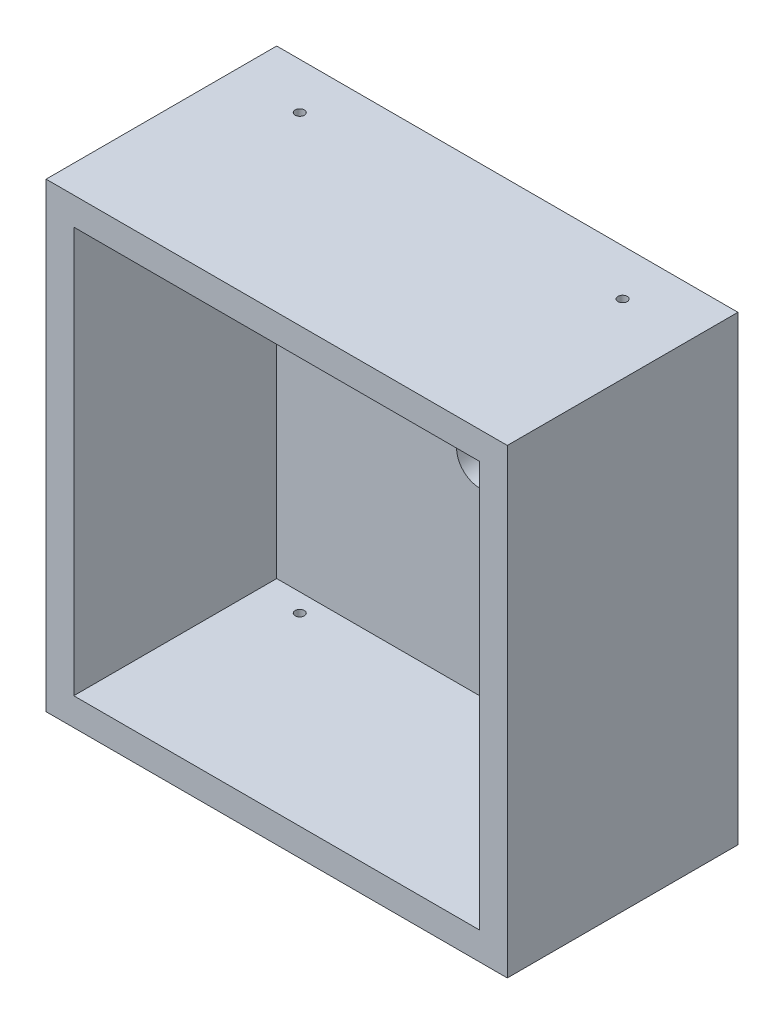
ISO-10303-21;
HEADER;
FILE_DESCRIPTION(('STEP AP214'),'2;1');
FILE_NAME('part.step','',(''),(''),'','','');
FILE_SCHEMA(('AUTOMOTIVE_DESIGN { 1 0 10303 214 1 1 1 1 }'));
ENDSEC;
DATA;
#1=APPLICATION_CONTEXT('core data for automotive mechanical design processes');
#2=APPLICATION_PROTOCOL_DEFINITION('international standard','automotive_design',2000,#1);
#3=PRODUCT_CONTEXT('',#1,'mechanical');
#4=PRODUCT('Part','Part','',(#3));
#5=PRODUCT_RELATED_PRODUCT_CATEGORY('part','',(#4));
#6=PRODUCT_DEFINITION_FORMATION('','',#4);
#7=PRODUCT_DEFINITION_CONTEXT('part definition',#1,'design');
#8=PRODUCT_DEFINITION('design','',#6,#7);
#9=PRODUCT_DEFINITION_SHAPE('','',#8);
#10=(LENGTH_UNIT() NAMED_UNIT(*) SI_UNIT(.MILLI.,.METRE.));
#11=(NAMED_UNIT(*) PLANE_ANGLE_UNIT() SI_UNIT($,.RADIAN.));
#12=(NAMED_UNIT(*) SI_UNIT($,.STERADIAN.) SOLID_ANGLE_UNIT());
#13=UNCERTAINTY_MEASURE_WITH_UNIT(LENGTH_MEASURE(1.E-05),#10,'distance_accuracy_value','');
#14=(GEOMETRIC_REPRESENTATION_CONTEXT(3) GLOBAL_UNCERTAINTY_ASSIGNED_CONTEXT((#13)) GLOBAL_UNIT_ASSIGNED_CONTEXT((#10,
#11,#12)) REPRESENTATION_CONTEXT('',''));
#15=CARTESIAN_POINT('',(0.,0.,0.));
#16=DIRECTION('',(0.,0.,1.));
#17=DIRECTION('',(1.,0.,0.));
#18=AXIS2_PLACEMENT_3D('',#15,#16,#17);
#19=CARTESIAN_POINT('',(0.,0.,6.));
#20=DIRECTION('',(0.,0.,1.));
#21=DIRECTION('',(1.,0.,0.));
#22=AXIS2_PLACEMENT_3D('',#19,#20,#21);
#23=PLANE('',#22);
#24=CARTESIAN_POINT('',(0.,0.,6.));
#25=DIRECTION('',(0.,0.,1.));
#26=DIRECTION('',(1.,0.,0.));
#27=AXIS2_PLACEMENT_3D('',#24,#25,#26);
#28=CIRCLE('',#27,5.);
#29=CARTESIAN_POINT('',(5.,0.,6.));
#30=VERTEX_POINT('',#29);
#31=EDGE_CURVE('E169',#30,#30,#28,.T.);
#32=ORIENTED_EDGE('',*,*,#31,.F.);
#33=EDGE_LOOP('',(#32));
#34=FACE_BOUND('',#33,.T.);
#35=DIRECTION('',(0.,-1.,0.));
#36=VECTOR('',#35,1.);
#37=CARTESIAN_POINT('',(-44.,44.,6.));
#38=LINE('',#37,#36);
#39=CARTESIAN_POINT('',(-44.,44.,6.));
#40=VERTEX_POINT('',#39);
#41=CARTESIAN_POINT('',(-44.,-44.,6.));
#42=VERTEX_POINT('',#41);
#43=EDGE_CURVE('E179',#40,#42,#38,.T.);
#44=ORIENTED_EDGE('',*,*,#43,.T.);
#45=DIRECTION('',(1.,0.,0.));
#46=VECTOR('',#45,1.);
#47=CARTESIAN_POINT('',(-44.,-44.,6.));
#48=LINE('',#47,#46);
#49=CARTESIAN_POINT('',(44.,-44.,6.));
#50=VERTEX_POINT('',#49);
#51=EDGE_CURVE('E184',#42,#50,#48,.T.);
#52=ORIENTED_EDGE('',*,*,#51,.T.);
#53=DIRECTION('',(0.,1.,0.));
#54=VECTOR('',#53,1.);
#55=CARTESIAN_POINT('',(44.,44.,6.));
#56=LINE('',#55,#54);
#57=CARTESIAN_POINT('',(44.,44.,6.));
#58=VERTEX_POINT('',#57);
#59=EDGE_CURVE('E41',#50,#58,#56,.T.);
#60=ORIENTED_EDGE('',*,*,#59,.T.);
#61=DIRECTION('',(-1.,0.,0.));
#62=VECTOR('',#61,1.);
#63=CARTESIAN_POINT('',(-44.,44.,6.));
#64=LINE('',#63,#62);
#65=EDGE_CURVE('E11',#58,#40,#64,.T.);
#66=ORIENTED_EDGE('',*,*,#65,.T.);
#67=EDGE_LOOP('',(#44,#52,#60,#66));
#68=FACE_BOUND('',#67,.T.);
#69=ADVANCED_FACE('F32',(#34,#68),#23,.T.);
#70=CARTESIAN_POINT('',(0.,0.,0.));
#71=DIRECTION('',(0.,0.,1.));
#72=DIRECTION('',(1.,0.,0.));
#73=AXIS2_PLACEMENT_3D('',#70,#71,#72);
#74=PLANE('',#73);
#75=CARTESIAN_POINT('',(0.,0.,0.));
#76=DIRECTION('',(0.,0.,1.));
#77=DIRECTION('',(1.,0.,0.));
#78=AXIS2_PLACEMENT_3D('',#75,#76,#77);
#79=CIRCLE('',#78,5.);
#80=CARTESIAN_POINT('',(5.,0.,0.));
#81=VERTEX_POINT('',#80);
#82=EDGE_CURVE('E176',#81,#81,#79,.T.);
#83=ORIENTED_EDGE('',*,*,#82,.T.);
#84=EDGE_LOOP('',(#83));
#85=FACE_BOUND('',#84,.T.);
#86=DIRECTION('',(1.,0.,0.));
#87=VECTOR('',#86,1.);
#88=CARTESIAN_POINT('',(-44.,-50.,0.));
#89=LINE('',#88,#87);
#90=CARTESIAN_POINT('',(-50.,-50.,0.));
#91=VERTEX_POINT('',#90);
#92=CARTESIAN_POINT('',(50.,-50.,0.));
#93=VERTEX_POINT('',#92);
#94=EDGE_CURVE('E164',#91,#93,#89,.T.);
#95=ORIENTED_EDGE('',*,*,#94,.F.);
#96=DIRECTION('',(0.,-1.,0.));
#97=VECTOR('',#96,1.);
#98=CARTESIAN_POINT('',(-50.,44.,0.));
#99=LINE('',#98,#97);
#100=CARTESIAN_POINT('',(-50.,50.,0.));
#101=VERTEX_POINT('',#100);
#102=EDGE_CURVE('E114',#101,#91,#99,.T.);
#103=ORIENTED_EDGE('',*,*,#102,.F.);
#104=DIRECTION('',(-1.,0.,0.));
#105=VECTOR('',#104,1.);
#106=CARTESIAN_POINT('',(50.,50.,0.));
#107=LINE('',#106,#105);
#108=CARTESIAN_POINT('',(50.,50.,0.));
#109=VERTEX_POINT('',#108);
#110=EDGE_CURVE('E112',#109,#101,#107,.T.);
#111=ORIENTED_EDGE('',*,*,#110,.F.);
#112=DIRECTION('',(0.,1.,0.));
#113=VECTOR('',#112,1.);
#114=CARTESIAN_POINT('',(50.,44.,0.));
#115=LINE('',#114,#113);
#116=EDGE_CURVE('E100',#93,#109,#115,.T.);
#117=ORIENTED_EDGE('',*,*,#116,.F.);
#118=EDGE_LOOP('',(#95,#103,#111,#117));
#119=FACE_BOUND('',#118,.T.);
#120=ADVANCED_FACE('F34',(#85,#119),#74,.F.);
#121=CARTESIAN_POINT('',(0.,0.,0.));
#122=DIRECTION('',(0.,0.,1.));
#123=DIRECTION('',(1.,0.,0.));
#124=AXIS2_PLACEMENT_3D('',#121,#122,#123);
#125=CYLINDRICAL_SURFACE('',#124,5.);
#126=ORIENTED_EDGE('',*,*,#82,.F.);
#127=EDGE_LOOP('',(#126));
#128=FACE_BOUND('',#127,.T.);
#129=ORIENTED_EDGE('',*,*,#31,.T.);
#130=EDGE_LOOP('',(#129));
#131=FACE_BOUND('',#130,.T.);
#132=ADVANCED_FACE('F247',(#128,#131),#125,.F.);
#133=CARTESIAN_POINT('',(0.,-44.,0.));
#134=DIRECTION('',(0.,1.,0.));
#135=DIRECTION('',(0.,0.,1.));
#136=AXIS2_PLACEMENT_3D('',#133,#134,#135);
#137=PLANE('',#136);
#138=CARTESIAN_POINT('',(-35.,-44.,10.));
#139=DIRECTION('',(0.,1.,0.));
#140=DIRECTION('',(0.,0.,1.));
#141=AXIS2_PLACEMENT_3D('',#138,#139,#140);
#142=CIRCLE('',#141,0.999999999999998);
#143=CARTESIAN_POINT('',(-35.,-44.,11.));
#144=VERTEX_POINT('',#143);
#145=EDGE_CURVE('E210',#144,#144,#142,.T.);
#146=ORIENTED_EDGE('',*,*,#145,.F.);
#147=EDGE_LOOP('',(#146));
#148=FACE_BOUND('',#147,.T.);
#149=CARTESIAN_POINT('',(35.,-44.,10.));
#150=DIRECTION('',(0.,1.,0.));
#151=DIRECTION('',(0.,0.,1.));
#152=AXIS2_PLACEMENT_3D('',#149,#150,#151);
#153=CIRCLE('',#152,0.999999999999998);
#154=CARTESIAN_POINT('',(35.,-44.,11.));
#155=VERTEX_POINT('',#154);
#156=EDGE_CURVE('E127',#155,#155,#153,.T.);
#157=ORIENTED_EDGE('',*,*,#156,.F.);
#158=EDGE_LOOP('',(#157));
#159=FACE_BOUND('',#158,.T.);
#160=ORIENTED_EDGE('',*,*,#51,.F.);
#161=DIRECTION('',(0.,0.,-1.));
#162=VECTOR('',#161,1.);
#163=CARTESIAN_POINT('',(-44.,-44.,0.));
#164=LINE('',#163,#162);
#165=CARTESIAN_POINT('',(-44.,-44.,50.));
#166=VERTEX_POINT('',#165);
#167=EDGE_CURVE('E156',#166,#42,#164,.T.);
#168=ORIENTED_EDGE('',*,*,#167,.F.);
#169=DIRECTION('',(-1.,0.,0.));
#170=VECTOR('',#169,1.);
#171=CARTESIAN_POINT('',(-44.,-44.,50.));
#172=LINE('',#171,#170);
#173=CARTESIAN_POINT('',(44.,-44.,50.));
#174=VERTEX_POINT('',#173);
#175=EDGE_CURVE('E167',#174,#166,#172,.T.);
#176=ORIENTED_EDGE('',*,*,#175,.F.);
#177=DIRECTION('',(0.,0.,1.));
#178=VECTOR('',#177,1.);
#179=CARTESIAN_POINT('',(44.,-44.,0.));
#180=LINE('',#179,#178);
#181=EDGE_CURVE('E55',#50,#174,#180,.T.);
#182=ORIENTED_EDGE('',*,*,#181,.F.);
#183=EDGE_LOOP('',(#160,#168,#176,#182));
#184=FACE_BOUND('',#183,.T.);
#185=ADVANCED_FACE('F253',(#148,#159,#184),#137,.T.);
#186=CARTESIAN_POINT('',(-44.,-50.,50.));
#187=DIRECTION('',(0.,0.,-1.));
#188=DIRECTION('',(-1.,0.,0.));
#189=AXIS2_PLACEMENT_3D('',#186,#187,#188);
#190=PLANE('',#189);
#191=DIRECTION('',(0.,1.,0.));
#192=VECTOR('',#191,1.);
#193=CARTESIAN_POINT('',(-44.,44.,50.));
#194=LINE('',#193,#192);
#195=CARTESIAN_POINT('',(-44.,44.,50.));
#196=VERTEX_POINT('',#195);
#197=EDGE_CURVE('E151',#166,#196,#194,.T.);
#198=ORIENTED_EDGE('',*,*,#197,.T.);
#199=DIRECTION('',(1.,0.,0.));
#200=VECTOR('',#199,1.);
#201=CARTESIAN_POINT('',(50.,44.,50.));
#202=LINE('',#201,#200);
#203=CARTESIAN_POINT('',(44.,44.,50.));
#204=VERTEX_POINT('',#203);
#205=EDGE_CURVE('E124',#196,#204,#202,.T.);
#206=ORIENTED_EDGE('',*,*,#205,.T.);
#207=DIRECTION('',(0.,-1.,0.));
#208=VECTOR('',#207,1.);
#209=CARTESIAN_POINT('',(44.,44.,50.));
#210=LINE('',#209,#208);
#211=EDGE_CURVE('E139',#204,#174,#210,.T.);
#212=ORIENTED_EDGE('',*,*,#211,.T.);
#213=ORIENTED_EDGE('',*,*,#175,.T.);
#214=EDGE_LOOP('',(#198,#206,#212,#213));
#215=FACE_BOUND('',#214,.T.);
#216=DIRECTION('',(1.,0.,0.));
#217=VECTOR('',#216,1.);
#218=CARTESIAN_POINT('',(50.,50.,50.));
#219=LINE('',#218,#217);
#220=CARTESIAN_POINT('',(-50.,50.,50.));
#221=VERTEX_POINT('',#220);
#222=CARTESIAN_POINT('',(50.,50.,50.));
#223=VERTEX_POINT('',#222);
#224=EDGE_CURVE('E123',#221,#223,#219,.T.);
#225=ORIENTED_EDGE('',*,*,#224,.F.);
#226=DIRECTION('',(0.,1.,0.));
#227=VECTOR('',#226,1.);
#228=CARTESIAN_POINT('',(-50.,44.,50.));
#229=LINE('',#228,#227);
#230=CARTESIAN_POINT('',(-50.,-50.,50.));
#231=VERTEX_POINT('',#230);
#232=EDGE_CURVE('E154',#231,#221,#229,.T.);
#233=ORIENTED_EDGE('',*,*,#232,.F.);
#234=DIRECTION('',(-1.,0.,0.));
#235=VECTOR('',#234,1.);
#236=CARTESIAN_POINT('',(-44.,-50.,50.));
#237=LINE('',#236,#235);
#238=CARTESIAN_POINT('',(50.,-50.,50.));
#239=VERTEX_POINT('',#238);
#240=EDGE_CURVE('E166',#239,#231,#237,.T.);
#241=ORIENTED_EDGE('',*,*,#240,.F.);
#242=DIRECTION('',(0.,-1.,0.));
#243=VECTOR('',#242,1.);
#244=CARTESIAN_POINT('',(50.,44.,50.));
#245=LINE('',#244,#243);
#246=EDGE_CURVE('E137',#223,#239,#245,.T.);
#247=ORIENTED_EDGE('',*,*,#246,.F.);
#248=EDGE_LOOP('',(#225,#233,#241,#247));
#249=FACE_BOUND('',#248,.T.);
#250=ADVANCED_FACE('F237',(#215,#249),#190,.F.);
#251=CARTESIAN_POINT('',(0.,-50.,0.));
#252=DIRECTION('',(0.,1.,0.));
#253=DIRECTION('',(0.,0.,1.));
#254=AXIS2_PLACEMENT_3D('',#251,#252,#253);
#255=PLANE('',#254);
#256=CARTESIAN_POINT('',(-35.,-50.,10.));
#257=DIRECTION('',(0.,1.,0.));
#258=DIRECTION('',(0.,0.,1.));
#259=AXIS2_PLACEMENT_3D('',#256,#257,#258);
#260=CIRCLE('',#259,0.999999999999998);
#261=CARTESIAN_POINT('',(-35.,-50.,11.));
#262=VERTEX_POINT('',#261);
#263=EDGE_CURVE('E217',#262,#262,#260,.T.);
#264=ORIENTED_EDGE('',*,*,#263,.T.);
#265=EDGE_LOOP('',(#264));
#266=FACE_BOUND('',#265,.T.);
#267=CARTESIAN_POINT('',(35.,-50.,10.));
#268=DIRECTION('',(0.,1.,0.));
#269=DIRECTION('',(0.,0.,1.));
#270=AXIS2_PLACEMENT_3D('',#267,#268,#269);
#271=CIRCLE('',#270,0.999999999999998);
#272=CARTESIAN_POINT('',(35.,-50.,11.));
#273=VERTEX_POINT('',#272);
#274=EDGE_CURVE('E200',#273,#273,#271,.T.);
#275=ORIENTED_EDGE('',*,*,#274,.T.);
#276=EDGE_LOOP('',(#275));
#277=FACE_BOUND('',#276,.T.);
#278=ORIENTED_EDGE('',*,*,#240,.T.);
#279=DIRECTION('',(0.,0.,1.));
#280=VECTOR('',#279,1.);
#281=CARTESIAN_POINT('',(-50.,-50.,0.));
#282=LINE('',#281,#280);
#283=EDGE_CURVE('E150',#91,#231,#282,.T.);
#284=ORIENTED_EDGE('',*,*,#283,.F.);
#285=ORIENTED_EDGE('',*,*,#94,.T.);
#286=DIRECTION('',(0.,0.,-1.));
#287=VECTOR('',#286,1.);
#288=CARTESIAN_POINT('',(50.,-50.,0.));
#289=LINE('',#288,#287);
#290=EDGE_CURVE('E107',#239,#93,#289,.T.);
#291=ORIENTED_EDGE('',*,*,#290,.F.);
#292=EDGE_LOOP('',(#278,#284,#285,#291));
#293=FACE_BOUND('',#292,.T.);
#294=ADVANCED_FACE('F257',(#266,#277,#293),#255,.F.);
#295=CARTESIAN_POINT('',(-50.,0.,0.));
#296=DIRECTION('',(1.,0.,0.));
#297=DIRECTION('',(0.,1.,0.));
#298=AXIS2_PLACEMENT_3D('',#295,#296,#297);
#299=PLANE('',#298);
#300=ORIENTED_EDGE('',*,*,#232,.T.);
#301=DIRECTION('',(0.,0.,1.));
#302=VECTOR('',#301,1.);
#303=CARTESIAN_POINT('',(-50.,50.,0.));
#304=LINE('',#303,#302);
#305=EDGE_CURVE('E118',#101,#221,#304,.T.);
#306=ORIENTED_EDGE('',*,*,#305,.F.);
#307=ORIENTED_EDGE('',*,*,#102,.T.);
#308=ORIENTED_EDGE('',*,*,#283,.T.);
#309=EDGE_LOOP('',(#300,#306,#307,#308));
#310=FACE_BOUND('',#309,.T.);
#311=ADVANCED_FACE('F263',(#310),#299,.F.);
#312=CARTESIAN_POINT('',(-44.,0.,0.));
#313=DIRECTION('',(1.,0.,0.));
#314=DIRECTION('',(0.,1.,0.));
#315=AXIS2_PLACEMENT_3D('',#312,#313,#314);
#316=PLANE('',#315);
#317=ORIENTED_EDGE('',*,*,#197,.F.);
#318=ORIENTED_EDGE('',*,*,#167,.T.);
#319=ORIENTED_EDGE('',*,*,#43,.F.);
#320=DIRECTION('',(0.,0.,-1.));
#321=VECTOR('',#320,1.);
#322=CARTESIAN_POINT('',(-44.,44.,0.));
#323=LINE('',#322,#321);
#324=EDGE_CURVE('E109',#196,#40,#323,.T.);
#325=ORIENTED_EDGE('',*,*,#324,.F.);
#326=EDGE_LOOP('',(#317,#318,#319,#325));
#327=FACE_BOUND('',#326,.T.);
#328=ADVANCED_FACE('F241',(#327),#316,.T.);
#329=CARTESIAN_POINT('',(50.,0.,0.));
#330=DIRECTION('',(1.,0.,0.));
#331=DIRECTION('',(0.,1.,0.));
#332=AXIS2_PLACEMENT_3D('',#329,#330,#331);
#333=PLANE('',#332);
#334=ORIENTED_EDGE('',*,*,#116,.T.);
#335=DIRECTION('',(0.,0.,-1.));
#336=VECTOR('',#335,1.);
#337=CARTESIAN_POINT('',(50.,50.,0.));
#338=LINE('',#337,#336);
#339=EDGE_CURVE('E105',#223,#109,#338,.T.);
#340=ORIENTED_EDGE('',*,*,#339,.F.);
#341=ORIENTED_EDGE('',*,*,#246,.T.);
#342=ORIENTED_EDGE('',*,*,#290,.T.);
#343=EDGE_LOOP('',(#334,#340,#341,#342));
#344=FACE_BOUND('',#343,.T.);
#345=ADVANCED_FACE('F102',(#344),#333,.T.);
#346=CARTESIAN_POINT('',(44.,0.,0.));
#347=DIRECTION('',(1.,0.,0.));
#348=DIRECTION('',(0.,1.,0.));
#349=AXIS2_PLACEMENT_3D('',#346,#347,#348);
#350=PLANE('',#349);
#351=ORIENTED_EDGE('',*,*,#59,.F.);
#352=ORIENTED_EDGE('',*,*,#181,.T.);
#353=ORIENTED_EDGE('',*,*,#211,.F.);
#354=DIRECTION('',(0.,0.,1.));
#355=VECTOR('',#354,1.);
#356=CARTESIAN_POINT('',(44.,44.,0.));
#357=LINE('',#356,#355);
#358=EDGE_CURVE('E134',#58,#204,#357,.T.);
#359=ORIENTED_EDGE('',*,*,#358,.F.);
#360=EDGE_LOOP('',(#351,#352,#353,#359));
#361=FACE_BOUND('',#360,.T.);
#362=ADVANCED_FACE('F269',(#361),#350,.F.);
#363=CARTESIAN_POINT('',(0.,50.,0.));
#364=DIRECTION('',(0.,-1.,0.));
#365=DIRECTION('',(0.,0.,-1.));
#366=AXIS2_PLACEMENT_3D('',#363,#364,#365);
#367=PLANE('',#366);
#368=CARTESIAN_POINT('',(-35.,50.,10.));
#369=DIRECTION('',(0.,1.,0.));
#370=DIRECTION('',(0.,0.,1.));
#371=AXIS2_PLACEMENT_3D('',#368,#369,#370);
#372=CIRCLE('',#371,0.999999999999998);
#373=CARTESIAN_POINT('',(-35.,50.,11.));
#374=VERTEX_POINT('',#373);
#375=EDGE_CURVE('E214',#374,#374,#372,.T.);
#376=ORIENTED_EDGE('',*,*,#375,.F.);
#377=EDGE_LOOP('',(#376));
#378=FACE_BOUND('',#377,.T.);
#379=CARTESIAN_POINT('',(35.,50.,10.));
#380=DIRECTION('',(0.,1.,0.));
#381=DIRECTION('',(0.,0.,1.));
#382=AXIS2_PLACEMENT_3D('',#379,#380,#381);
#383=CIRCLE('',#382,0.999999999999998);
#384=CARTESIAN_POINT('',(35.,50.,11.));
#385=VERTEX_POINT('',#384);
#386=EDGE_CURVE('E205',#385,#385,#383,.T.);
#387=ORIENTED_EDGE('',*,*,#386,.F.);
#388=EDGE_LOOP('',(#387));
#389=FACE_BOUND('',#388,.T.);
#390=ORIENTED_EDGE('',*,*,#339,.T.);
#391=ORIENTED_EDGE('',*,*,#110,.T.);
#392=ORIENTED_EDGE('',*,*,#305,.T.);
#393=ORIENTED_EDGE('',*,*,#224,.T.);
#394=EDGE_LOOP('',(#390,#391,#392,#393));
#395=FACE_BOUND('',#394,.T.);
#396=ADVANCED_FACE('F121',(#378,#389,#395),#367,.F.);
#397=CARTESIAN_POINT('',(0.,44.,0.));
#398=DIRECTION('',(0.,-1.,0.));
#399=DIRECTION('',(0.,0.,-1.));
#400=AXIS2_PLACEMENT_3D('',#397,#398,#399);
#401=PLANE('',#400);
#402=CARTESIAN_POINT('',(-35.,44.,10.));
#403=DIRECTION('',(0.,-1.,0.));
#404=DIRECTION('',(0.,0.,-1.));
#405=AXIS2_PLACEMENT_3D('',#402,#403,#404);
#406=CIRCLE('',#405,0.999999999999998);
#407=CARTESIAN_POINT('',(-35.,44.,9.00000000000001));
#408=VERTEX_POINT('',#407);
#409=EDGE_CURVE('E36',#408,#408,#406,.T.);
#410=ORIENTED_EDGE('',*,*,#409,.F.);
#411=EDGE_LOOP('',(#410));
#412=FACE_BOUND('',#411,.T.);
#413=CARTESIAN_POINT('',(35.,44.,10.));
#414=DIRECTION('',(0.,-1.,0.));
#415=DIRECTION('',(0.,0.,-1.));
#416=AXIS2_PLACEMENT_3D('',#413,#414,#415);
#417=CIRCLE('',#416,0.999999999999998);
#418=CARTESIAN_POINT('',(35.,44.,9.00000000000001));
#419=VERTEX_POINT('',#418);
#420=EDGE_CURVE('E198',#419,#419,#417,.T.);
#421=ORIENTED_EDGE('',*,*,#420,.F.);
#422=EDGE_LOOP('',(#421));
#423=FACE_BOUND('',#422,.T.);
#424=ORIENTED_EDGE('',*,*,#205,.F.);
#425=ORIENTED_EDGE('',*,*,#324,.T.);
#426=ORIENTED_EDGE('',*,*,#65,.F.);
#427=ORIENTED_EDGE('',*,*,#358,.T.);
#428=EDGE_LOOP('',(#424,#425,#426,#427));
#429=FACE_BOUND('',#428,.T.);
#430=ADVANCED_FACE('F227',(#412,#423,#429),#401,.T.);
#431=CARTESIAN_POINT('',(35.,-50.,10.));
#432=DIRECTION('',(0.,1.,0.));
#433=DIRECTION('',(0.,0.,1.));
#434=AXIS2_PLACEMENT_3D('',#431,#432,#433);
#435=CYLINDRICAL_SURFACE('',#434,0.999999999999998);
#436=ORIENTED_EDGE('',*,*,#420,.T.);
#437=EDGE_LOOP('',(#436));
#438=FACE_BOUND('',#437,.T.);
#439=ORIENTED_EDGE('',*,*,#386,.T.);
#440=EDGE_LOOP('',(#439));
#441=FACE_BOUND('',#440,.T.);
#442=ADVANCED_FACE('F230',(#438,#441),#435,.F.);
#443=ORIENTED_EDGE('',*,*,#156,.T.);
#444=EDGE_LOOP('',(#443));
#445=FACE_BOUND('',#444,.T.);
#446=ORIENTED_EDGE('',*,*,#274,.F.);
#447=EDGE_LOOP('',(#446));
#448=FACE_BOUND('',#447,.T.);
#449=ADVANCED_FACE('F280',(#445,#448),#435,.F.);
#450=CARTESIAN_POINT('',(-35.,-50.,10.));
#451=DIRECTION('',(0.,1.,0.));
#452=DIRECTION('',(0.,0.,1.));
#453=AXIS2_PLACEMENT_3D('',#450,#451,#452);
#454=CYLINDRICAL_SURFACE('',#453,0.999999999999998);
#455=ORIENTED_EDGE('',*,*,#409,.T.);
#456=EDGE_LOOP('',(#455));
#457=FACE_BOUND('',#456,.T.);
#458=ORIENTED_EDGE('',*,*,#375,.T.);
#459=EDGE_LOOP('',(#458));
#460=FACE_BOUND('',#459,.T.);
#461=ADVANCED_FACE('F224',(#457,#460),#454,.F.);
#462=ORIENTED_EDGE('',*,*,#145,.T.);
#463=EDGE_LOOP('',(#462));
#464=FACE_BOUND('',#463,.T.);
#465=ORIENTED_EDGE('',*,*,#263,.F.);
#466=EDGE_LOOP('',(#465));
#467=FACE_BOUND('',#466,.T.);
#468=ADVANCED_FACE('F282',(#464,#467),#454,.F.);
#469=CLOSED_SHELL('',(#69,#120,#132,#185,#250,#294,#311,#328,#345,#362,#396,#430,#442,#449,#461,#468));
#470=MANIFOLD_SOLID_BREP('B2',#469);
#471=ADVANCED_BREP_SHAPE_REPRESENTATION('',(#18,#470),#14);
#472=SHAPE_DEFINITION_REPRESENTATION(#9,#471);
ENDSEC;
END-ISO-10303-21;
